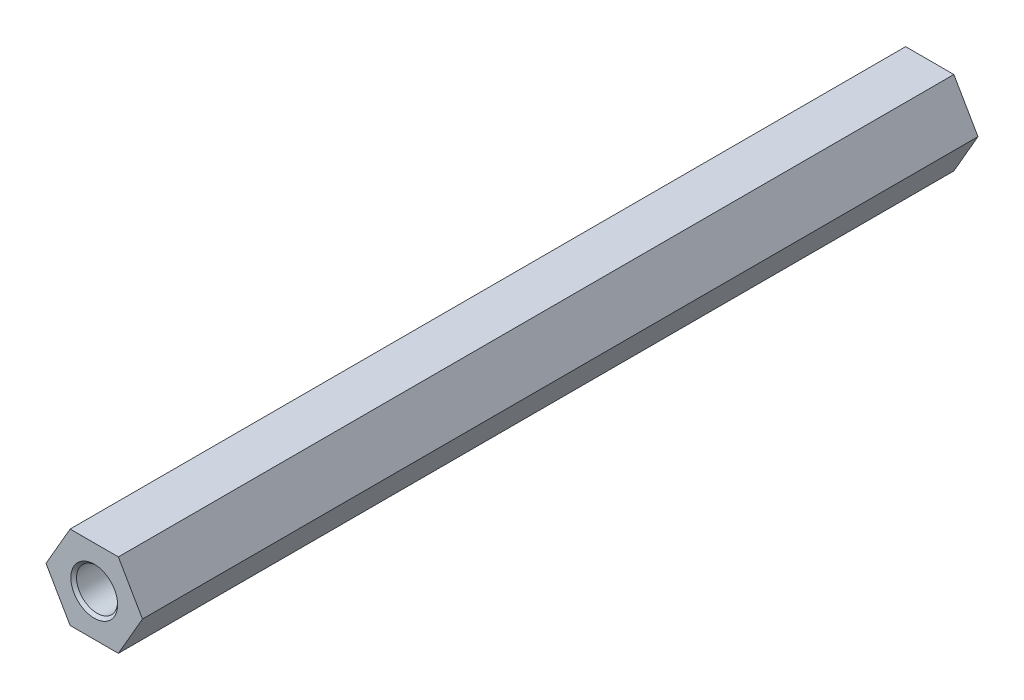
ISO-10303-21;
HEADER;
FILE_DESCRIPTION(('STEP AP214'),'2;1');
FILE_NAME('part.step','',(''),(''),'','','');
FILE_SCHEMA(('AUTOMOTIVE_DESIGN { 1 0 10303 214 1 1 1 1 }'));
ENDSEC;
DATA;
#1=APPLICATION_CONTEXT('core data for automotive mechanical design processes');
#2=APPLICATION_PROTOCOL_DEFINITION('international standard','automotive_design',2000,#1);
#3=PRODUCT_CONTEXT('',#1,'mechanical');
#4=PRODUCT('Part','Part','',(#3));
#5=PRODUCT_RELATED_PRODUCT_CATEGORY('part','',(#4));
#6=PRODUCT_DEFINITION_FORMATION('','',#4);
#7=PRODUCT_DEFINITION_CONTEXT('part definition',#1,'design');
#8=PRODUCT_DEFINITION('design','',#6,#7);
#9=PRODUCT_DEFINITION_SHAPE('','',#8);
#10=(LENGTH_UNIT() NAMED_UNIT(*) SI_UNIT(.MILLI.,.METRE.));
#11=(NAMED_UNIT(*) PLANE_ANGLE_UNIT() SI_UNIT($,.RADIAN.));
#12=(NAMED_UNIT(*) SI_UNIT($,.STERADIAN.) SOLID_ANGLE_UNIT());
#13=UNCERTAINTY_MEASURE_WITH_UNIT(LENGTH_MEASURE(1.E-05),#10,'distance_accuracy_value','');
#14=(GEOMETRIC_REPRESENTATION_CONTEXT(3) GLOBAL_UNCERTAINTY_ASSIGNED_CONTEXT((#13)) GLOBAL_UNIT_ASSIGNED_CONTEXT((#10,
#11,#12)) REPRESENTATION_CONTEXT('',''));
#15=CARTESIAN_POINT('',(0.,0.,0.));
#16=DIRECTION('',(0.,0.,1.));
#17=DIRECTION('',(1.,0.,0.));
#18=AXIS2_PLACEMENT_3D('',#15,#16,#17);
#19=CARTESIAN_POINT('',(-2.88675134594813,0.,-25.));
#20=DIRECTION('',(-0.866025403784439,-0.5,0.));
#21=DIRECTION('',(0.5,-0.866025403784439,0.));
#22=AXIS2_PLACEMENT_3D('',#19,#20,#21);
#23=PLANE('',#22);
#24=DIRECTION('',(0.,0.,1.));
#25=VECTOR('',#24,1.);
#26=CARTESIAN_POINT('',(-1.44337567297407,-2.5,-25.));
#27=LINE('',#26,#25);
#28=CARTESIAN_POINT('',(-1.44337567297407,-2.5,-24.999866055957));
#29=VERTEX_POINT('',#28);
#30=CARTESIAN_POINT('',(-1.44337567297407,-2.5,24.9997680021121));
#31=VERTEX_POINT('',#30);
#32=EDGE_CURVE('E141',#29,#31,#27,.T.);
#33=ORIENTED_EDGE('',*,*,#32,.T.);
#34=DIRECTION('',(-0.5,0.866025403784439,0.));
#35=VECTOR('',#34,1.);
#36=CARTESIAN_POINT('',(-2.88675134594813,0.,24.9997680021121));
#37=LINE('',#36,#35);
#38=CARTESIAN_POINT('',(-2.88675134594813,0.,24.9997680021121));
#39=VERTEX_POINT('',#38);
#40=EDGE_CURVE('E179',#31,#39,#37,.T.);
#41=ORIENTED_EDGE('',*,*,#40,.T.);
#42=DIRECTION('',(0.,0.,1.));
#43=VECTOR('',#42,1.);
#44=CARTESIAN_POINT('',(-2.88675134594813,0.,-25.));
#45=LINE('',#44,#43);
#46=CARTESIAN_POINT('',(-2.88675134594813,0.,-24.999866055957));
#47=VERTEX_POINT('',#46);
#48=EDGE_CURVE('E147',#47,#39,#45,.T.);
#49=ORIENTED_EDGE('',*,*,#48,.F.);
#50=DIRECTION('',(0.5,-0.866025403784439,0.));
#51=VECTOR('',#50,1.);
#52=CARTESIAN_POINT('',(-1.44337567297407,-2.5,-24.999866055957));
#53=LINE('',#52,#51);
#54=EDGE_CURVE('E177',#47,#29,#53,.T.);
#55=ORIENTED_EDGE('',*,*,#54,.T.);
#56=EDGE_LOOP('',(#33,#41,#49,#55));
#57=FACE_BOUND('',#56,.T.);
#58=ADVANCED_FACE('F34',(#57),#23,.T.);
#59=CARTESIAN_POINT('',(-1.44337567297406,2.5,-25.));
#60=DIRECTION('',(-0.866025403784439,0.5,0.));
#61=DIRECTION('',(-0.5,-0.866025403784439,0.));
#62=AXIS2_PLACEMENT_3D('',#59,#60,#61);
#63=PLANE('',#62);
#64=ORIENTED_EDGE('',*,*,#48,.T.);
#65=DIRECTION('',(0.5,0.866025403784439,0.));
#66=VECTOR('',#65,1.);
#67=CARTESIAN_POINT('',(-1.44337567297406,2.5,24.9997680021121));
#68=LINE('',#67,#66);
#69=CARTESIAN_POINT('',(-1.44337567297406,2.5,24.9997680021121));
#70=VERTEX_POINT('',#69);
#71=EDGE_CURVE('E184',#39,#70,#68,.T.);
#72=ORIENTED_EDGE('',*,*,#71,.T.);
#73=DIRECTION('',(0.,0.,1.));
#74=VECTOR('',#73,1.);
#75=CARTESIAN_POINT('',(-1.44337567297406,2.5,-25.));
#76=LINE('',#75,#74);
#77=CARTESIAN_POINT('',(-1.44337567297406,2.5,-24.999866055957));
#78=VERTEX_POINT('',#77);
#79=EDGE_CURVE('E151',#78,#70,#76,.T.);
#80=ORIENTED_EDGE('',*,*,#79,.F.);
#81=DIRECTION('',(-0.5,-0.866025403784439,0.));
#82=VECTOR('',#81,1.);
#83=CARTESIAN_POINT('',(-2.88675134594813,0.,-24.999866055957));
#84=LINE('',#83,#82);
#85=EDGE_CURVE('E182',#78,#47,#84,.T.);
#86=ORIENTED_EDGE('',*,*,#85,.T.);
#87=EDGE_LOOP('',(#64,#72,#80,#86));
#88=FACE_BOUND('',#87,.T.);
#89=ADVANCED_FACE('F260',(#88),#63,.T.);
#90=CARTESIAN_POINT('',(1.44337567297407,2.5,-25.));
#91=DIRECTION('',(0.,1.,0.));
#92=DIRECTION('',(0.,0.,1.));
#93=AXIS2_PLACEMENT_3D('',#90,#91,#92);
#94=PLANE('',#93);
#95=ORIENTED_EDGE('',*,*,#79,.T.);
#96=DIRECTION('',(1.,0.,0.));
#97=VECTOR('',#96,1.);
#98=CARTESIAN_POINT('',(1.44337567297407,2.5,24.9997680021121));
#99=LINE('',#98,#97);
#100=CARTESIAN_POINT('',(1.44337567297407,2.5,24.9997680021121));
#101=VERTEX_POINT('',#100);
#102=EDGE_CURVE('E188',#70,#101,#99,.T.);
#103=ORIENTED_EDGE('',*,*,#102,.T.);
#104=DIRECTION('',(0.,0.,1.));
#105=VECTOR('',#104,1.);
#106=CARTESIAN_POINT('',(1.44337567297407,2.5,-25.));
#107=LINE('',#106,#105);
#108=CARTESIAN_POINT('',(1.44337567297407,2.5,-24.999866055957));
#109=VERTEX_POINT('',#108);
#110=EDGE_CURVE('E154',#109,#101,#107,.T.);
#111=ORIENTED_EDGE('',*,*,#110,.F.);
#112=DIRECTION('',(-1.,0.,0.));
#113=VECTOR('',#112,1.);
#114=CARTESIAN_POINT('',(-1.44337567297406,2.5,-24.999866055957));
#115=LINE('',#114,#113);
#116=EDGE_CURVE('E186',#109,#78,#115,.T.);
#117=ORIENTED_EDGE('',*,*,#116,.T.);
#118=EDGE_LOOP('',(#95,#103,#111,#117));
#119=FACE_BOUND('',#118,.T.);
#120=ADVANCED_FACE('F266',(#119),#94,.T.);
#121=CARTESIAN_POINT('',(2.88675134594813,0.,-25.));
#122=DIRECTION('',(0.866025403784439,0.5,0.));
#123=DIRECTION('',(-0.5,0.866025403784439,0.));
#124=AXIS2_PLACEMENT_3D('',#121,#122,#123);
#125=PLANE('',#124);
#126=ORIENTED_EDGE('',*,*,#110,.T.);
#127=DIRECTION('',(0.5,-0.866025403784439,0.));
#128=VECTOR('',#127,1.);
#129=CARTESIAN_POINT('',(2.88675134594813,0.,24.9997680021121));
#130=LINE('',#129,#128);
#131=CARTESIAN_POINT('',(2.88675134594813,0.,24.9997680021121));
#132=VERTEX_POINT('',#131);
#133=EDGE_CURVE('E192',#101,#132,#130,.T.);
#134=ORIENTED_EDGE('',*,*,#133,.T.);
#135=DIRECTION('',(0.,0.,1.));
#136=VECTOR('',#135,1.);
#137=CARTESIAN_POINT('',(2.88675134594813,0.,-25.));
#138=LINE('',#137,#136);
#139=CARTESIAN_POINT('',(2.88675134594813,0.,-24.999866055957));
#140=VERTEX_POINT('',#139);
#141=EDGE_CURVE('E157',#140,#132,#138,.T.);
#142=ORIENTED_EDGE('',*,*,#141,.F.);
#143=DIRECTION('',(-0.5,0.866025403784439,0.));
#144=VECTOR('',#143,1.);
#145=CARTESIAN_POINT('',(1.44337567297407,2.5,-24.999866055957));
#146=LINE('',#145,#144);
#147=EDGE_CURVE('E190',#140,#109,#146,.T.);
#148=ORIENTED_EDGE('',*,*,#147,.T.);
#149=EDGE_LOOP('',(#126,#134,#142,#148));
#150=FACE_BOUND('',#149,.T.);
#151=ADVANCED_FACE('F365',(#150),#125,.T.);
#152=CARTESIAN_POINT('',(1.44337567297406,-2.5,-25.));
#153=DIRECTION('',(0.866025403784439,-0.5,0.));
#154=DIRECTION('',(0.5,0.866025403784439,0.));
#155=AXIS2_PLACEMENT_3D('',#152,#153,#154);
#156=PLANE('',#155);
#157=ORIENTED_EDGE('',*,*,#141,.T.);
#158=DIRECTION('',(-0.5,-0.866025403784439,0.));
#159=VECTOR('',#158,1.);
#160=CARTESIAN_POINT('',(1.44337567297406,-2.5,24.9997680021121));
#161=LINE('',#160,#159);
#162=CARTESIAN_POINT('',(1.44337567297406,-2.5,24.9997680021121));
#163=VERTEX_POINT('',#162);
#164=EDGE_CURVE('E196',#132,#163,#161,.T.);
#165=ORIENTED_EDGE('',*,*,#164,.T.);
#166=DIRECTION('',(0.,0.,1.));
#167=VECTOR('',#166,1.);
#168=CARTESIAN_POINT('',(1.44337567297406,-2.5,-25.));
#169=LINE('',#168,#167);
#170=CARTESIAN_POINT('',(1.44337567297406,-2.5,-24.999866055957));
#171=VERTEX_POINT('',#170);
#172=EDGE_CURVE('E160',#171,#163,#169,.T.);
#173=ORIENTED_EDGE('',*,*,#172,.F.);
#174=DIRECTION('',(0.5,0.866025403784439,0.));
#175=VECTOR('',#174,1.);
#176=CARTESIAN_POINT('',(2.88675134594813,0.,-24.999866055957));
#177=LINE('',#176,#175);
#178=EDGE_CURVE('E194',#171,#140,#177,.T.);
#179=ORIENTED_EDGE('',*,*,#178,.T.);
#180=EDGE_LOOP('',(#157,#165,#173,#179));
#181=FACE_BOUND('',#180,.T.);
#182=ADVANCED_FACE('F367',(#181),#156,.T.);
#183=CARTESIAN_POINT('',(-1.44337567297407,-2.5,-25.));
#184=DIRECTION('',(0.,-1.,0.));
#185=DIRECTION('',(1.,0.,0.));
#186=AXIS2_PLACEMENT_3D('',#183,#184,#185);
#187=PLANE('',#186);
#188=ORIENTED_EDGE('',*,*,#172,.T.);
#189=DIRECTION('',(-1.,0.,0.));
#190=VECTOR('',#189,1.);
#191=CARTESIAN_POINT('',(-1.44337567297407,-2.5,24.9997680021121));
#192=LINE('',#191,#190);
#193=EDGE_CURVE('E201',#163,#31,#192,.T.);
#194=ORIENTED_EDGE('',*,*,#193,.T.);
#195=ORIENTED_EDGE('',*,*,#32,.F.);
#196=DIRECTION('',(1.,0.,0.));
#197=VECTOR('',#196,1.);
#198=CARTESIAN_POINT('',(1.44337567297406,-2.5,-24.999866055957));
#199=LINE('',#198,#197);
#200=EDGE_CURVE('E198',#29,#171,#199,.T.);
#201=ORIENTED_EDGE('',*,*,#200,.T.);
#202=EDGE_LOOP('',(#188,#194,#195,#201));
#203=FACE_BOUND('',#202,.T.);
#204=ADVANCED_FACE('F271',(#203),#187,.T.);
#205=CARTESIAN_POINT('',(0.,0.,-25.));
#206=DIRECTION('',(0.,0.,1.));
#207=DIRECTION('',(1.,0.,0.));
#208=AXIS2_PLACEMENT_3D('',#205,#206,#207);
#209=PLANE('',#208);
#210=CARTESIAN_POINT('',(0.,0.,-25.));
#211=DIRECTION('',(0.,0.,1.));
#212=DIRECTION('',(1.,0.,0.));
#213=AXIS2_PLACEMENT_3D('',#210,#211,#212);
#214=CIRCLE('',#213,1.39999999999998);
#215=CARTESIAN_POINT('',(1.39999999999998,0.,-25.));
#216=VERTEX_POINT('',#215);
#217=EDGE_CURVE('E244',#216,#216,#214,.T.);
#218=ORIENTED_EDGE('',*,*,#217,.T.);
#219=EDGE_LOOP('',(#218));
#220=FACE_BOUND('',#219,.T.);
#221=DIRECTION('',(-0.5,-0.866025403784439,0.));
#222=VECTOR('',#221,1.);
#223=CARTESIAN_POINT('',(1.44317475690954,-2.49988400105607,-25.));
#224=LINE('',#223,#222);
#225=CARTESIAN_POINT('',(2.8864834578621,0.,-25.));
#226=VERTEX_POINT('',#225);
#227=CARTESIAN_POINT('',(1.44324172893105,-2.49976800211214,-25.));
#228=VERTEX_POINT('',#227);
#229=EDGE_CURVE('E49',#226,#228,#224,.T.);
#230=ORIENTED_EDGE('',*,*,#229,.T.);
#231=DIRECTION('',(-1.,0.,0.));
#232=VECTOR('',#231,1.);
#233=CARTESIAN_POINT('',(-1.44337567297407,-2.49976800211213,-25.));
#234=LINE('',#233,#232);
#235=CARTESIAN_POINT('',(-1.44324172893105,-2.49976800211213,-25.));
#236=VERTEX_POINT('',#235);
#237=EDGE_CURVE('E211',#228,#236,#234,.T.);
#238=ORIENTED_EDGE('',*,*,#237,.T.);
#239=DIRECTION('',(-0.5,0.866025403784439,0.));
#240=VECTOR('',#239,1.);
#241=CARTESIAN_POINT('',(-2.88655042988361,0.000115998943928501,-25.));
#242=LINE('',#241,#240);
#243=CARTESIAN_POINT('',(-2.8864834578621,0.,-25.));
#244=VERTEX_POINT('',#243);
#245=EDGE_CURVE('E203',#236,#244,#242,.T.);
#246=ORIENTED_EDGE('',*,*,#245,.T.);
#247=DIRECTION('',(0.5,0.866025403784439,0.));
#248=VECTOR('',#247,1.);
#249=CARTESIAN_POINT('',(-1.44317475690954,2.49988400105607,-25.));
#250=LINE('',#249,#248);
#251=CARTESIAN_POINT('',(-1.44324172893105,2.49976800211213,-25.));
#252=VERTEX_POINT('',#251);
#253=EDGE_CURVE('E205',#244,#252,#250,.T.);
#254=ORIENTED_EDGE('',*,*,#253,.T.);
#255=DIRECTION('',(1.,0.,0.));
#256=VECTOR('',#255,1.);
#257=CARTESIAN_POINT('',(1.44337567297407,2.49976800211213,-25.));
#258=LINE('',#257,#256);
#259=CARTESIAN_POINT('',(1.44324172893106,2.49976800211213,-25.));
#260=VERTEX_POINT('',#259);
#261=EDGE_CURVE('E207',#252,#260,#258,.T.);
#262=ORIENTED_EDGE('',*,*,#261,.T.);
#263=DIRECTION('',(0.5,-0.866025403784439,0.));
#264=VECTOR('',#263,1.);
#265=CARTESIAN_POINT('',(2.88655042988361,-0.000115998943928043,-25.));
#266=LINE('',#265,#264);
#267=EDGE_CURVE('E54',#260,#226,#266,.T.);
#268=ORIENTED_EDGE('',*,*,#267,.T.);
#269=EDGE_LOOP('',(#230,#238,#246,#254,#262,#268));
#270=FACE_BOUND('',#269,.T.);
#271=ADVANCED_FACE('F331',(#220,#270),#209,.F.);
#272=CARTESIAN_POINT('',(0.,0.,25.));
#273=DIRECTION('',(0.,0.,1.));
#274=DIRECTION('',(1.,0.,0.));
#275=AXIS2_PLACEMENT_3D('',#272,#273,#274);
#276=PLANE('',#275);
#277=CARTESIAN_POINT('',(0.,0.,25.));
#278=DIRECTION('',(0.,0.,1.));
#279=DIRECTION('',(1.,0.,0.));
#280=AXIS2_PLACEMENT_3D('',#277,#278,#279);
#281=CIRCLE('',#280,1.39999999999998);
#282=CARTESIAN_POINT('',(1.39999999999998,0.,25.));
#283=VERTEX_POINT('',#282);
#284=EDGE_CURVE('E11',#283,#283,#281,.F.);
#285=ORIENTED_EDGE('',*,*,#284,.T.);
#286=EDGE_LOOP('',(#285));
#287=FACE_BOUND('',#286,.T.);
#288=DIRECTION('',(-0.5,-0.866025403784439,0.));
#289=VECTOR('',#288,1.);
#290=CARTESIAN_POINT('',(-2.16494751051716,1.24993302797849,25.));
#291=LINE('',#290,#289);
#292=CARTESIAN_POINT('',(-1.44329834034477,2.49986605595699,25.));
#293=VERTEX_POINT('',#292);
#294=CARTESIAN_POINT('',(-2.88659668068955,0.,25.));
#295=VERTEX_POINT('',#294);
#296=EDGE_CURVE('E172',#293,#295,#291,.T.);
#297=ORIENTED_EDGE('',*,*,#296,.T.);
#298=DIRECTION('',(0.5,-0.866025403784439,0.));
#299=VECTOR('',#298,1.);
#300=CARTESIAN_POINT('',(-2.16494751051716,-1.24993302797849,25.));
#301=LINE('',#300,#299);
#302=CARTESIAN_POINT('',(-1.44329834034478,-2.49986605595699,25.));
#303=VERTEX_POINT('',#302);
#304=EDGE_CURVE('E174',#295,#303,#301,.T.);
#305=ORIENTED_EDGE('',*,*,#304,.T.);
#306=DIRECTION('',(1.,0.,0.));
#307=VECTOR('',#306,1.);
#308=CARTESIAN_POINT('',(0.,-2.49986605595699,25.));
#309=LINE('',#308,#307);
#310=CARTESIAN_POINT('',(1.44329834034477,-2.49986605595699,25.));
#311=VERTEX_POINT('',#310);
#312=EDGE_CURVE('E150',#303,#311,#309,.T.);
#313=ORIENTED_EDGE('',*,*,#312,.T.);
#314=DIRECTION('',(0.5,0.866025403784439,0.));
#315=VECTOR('',#314,1.);
#316=CARTESIAN_POINT('',(2.16494751051716,-1.24993302797849,25.));
#317=LINE('',#316,#315);
#318=CARTESIAN_POINT('',(2.88659668068955,0.,25.));
#319=VERTEX_POINT('',#318);
#320=EDGE_CURVE('E166',#311,#319,#317,.T.);
#321=ORIENTED_EDGE('',*,*,#320,.T.);
#322=DIRECTION('',(-0.5,0.866025403784439,0.));
#323=VECTOR('',#322,1.);
#324=CARTESIAN_POINT('',(2.16494751051716,1.24993302797849,25.));
#325=LINE('',#324,#323);
#326=CARTESIAN_POINT('',(1.44329834034478,2.49986605595699,25.));
#327=VERTEX_POINT('',#326);
#328=EDGE_CURVE('E168',#319,#327,#325,.T.);
#329=ORIENTED_EDGE('',*,*,#328,.T.);
#330=DIRECTION('',(-1.,0.,0.));
#331=VECTOR('',#330,1.);
#332=CARTESIAN_POINT('',(0.,2.49986605595699,25.));
#333=LINE('',#332,#331);
#334=EDGE_CURVE('E170',#327,#293,#333,.T.);
#335=ORIENTED_EDGE('',*,*,#334,.T.);
#336=EDGE_LOOP('',(#297,#305,#313,#321,#329,#335));
#337=FACE_BOUND('',#336,.T.);
#338=ADVANCED_FACE('F357',(#287,#337),#276,.T.);
#339=CARTESIAN_POINT('',(0.,0.,-14.));
#340=DIRECTION('',(0.,0.,-1.));
#341=DIRECTION('',(-1.,0.,0.));
#342=AXIS2_PLACEMENT_3D('',#339,#340,#341);
#343=CONICAL_SURFACE('',#342,1.22949999999999,1.02974425867664);
#344=CARTESIAN_POINT('',(0.,0.,-13.2612418689056));
#345=VERTEX_POINT('',#344);
#346=VERTEX_LOOP('',#345);
#347=FACE_BOUND('',#346,.T.);
#348=CARTESIAN_POINT('',(0.,0.,-14.));
#349=DIRECTION('',(0.,0.,-1.));
#350=DIRECTION('',(-1.,0.,0.));
#351=AXIS2_PLACEMENT_3D('',#348,#349,#350);
#352=CIRCLE('',#351,1.22949999999999);
#353=CARTESIAN_POINT('',(-1.22949999999999,0.,-14.));
#354=VERTEX_POINT('',#353);
#355=EDGE_CURVE('E137',#354,#354,#352,.T.);
#356=ORIENTED_EDGE('',*,*,#355,.T.);
#357=EDGE_LOOP('',(#356));
#358=FACE_BOUND('',#357,.T.);
#359=ADVANCED_FACE('F379',(#347,#358),#343,.F.);
#360=CARTESIAN_POINT('',(0.,0.,-25.));
#361=DIRECTION('',(0.,0.,-1.));
#362=DIRECTION('',(-1.,0.,0.));
#363=AXIS2_PLACEMENT_3D('',#360,#361,#362);
#364=CYLINDRICAL_SURFACE('',#363,1.22949999999999);
#365=CARTESIAN_POINT('',(0.,0.,-24.8295));
#366=DIRECTION('',(0.,0.,1.));
#367=DIRECTION('',(1.,0.,0.));
#368=AXIS2_PLACEMENT_3D('',#365,#366,#367);
#369=CIRCLE('',#368,1.22949999999999);
#370=CARTESIAN_POINT('',(1.22949999999999,0.,-24.8295));
#371=VERTEX_POINT('',#370);
#372=EDGE_CURVE('E213',#371,#371,#369,.F.);
#373=ORIENTED_EDGE('',*,*,#372,.T.);
#374=EDGE_LOOP('',(#373));
#375=FACE_BOUND('',#374,.T.);
#376=ORIENTED_EDGE('',*,*,#355,.F.);
#377=EDGE_LOOP('',(#376));
#378=FACE_BOUND('',#377,.T.);
#379=ADVANCED_FACE('F131',(#375,#378),#364,.F.);
#380=CARTESIAN_POINT('',(0.,0.,14.));
#381=DIRECTION('',(0.,0.,1.));
#382=DIRECTION('',(1.,0.,0.));
#383=AXIS2_PLACEMENT_3D('',#380,#381,#382);
#384=CONICAL_SURFACE('',#383,1.22949999999999,1.02974425867664);
#385=CARTESIAN_POINT('',(0.,0.,13.2612418689056));
#386=VERTEX_POINT('',#385);
#387=VERTEX_LOOP('',#386);
#388=FACE_BOUND('',#387,.T.);
#389=CARTESIAN_POINT('',(0.,0.,14.));
#390=DIRECTION('',(0.,0.,1.));
#391=DIRECTION('',(1.,0.,0.));
#392=AXIS2_PLACEMENT_3D('',#389,#390,#391);
#393=CIRCLE('',#392,1.22949999999999);
#394=CARTESIAN_POINT('',(1.22949999999999,0.,14.));
#395=VERTEX_POINT('',#394);
#396=EDGE_CURVE('E135',#395,#395,#393,.T.);
#397=ORIENTED_EDGE('',*,*,#396,.T.);
#398=EDGE_LOOP('',(#397));
#399=FACE_BOUND('',#398,.T.);
#400=ADVANCED_FACE('F127',(#388,#399),#384,.F.);
#401=CARTESIAN_POINT('',(0.,0.,25.));
#402=DIRECTION('',(0.,0.,1.));
#403=DIRECTION('',(1.,0.,0.));
#404=AXIS2_PLACEMENT_3D('',#401,#402,#403);
#405=CYLINDRICAL_SURFACE('',#404,1.22949999999999);
#406=CARTESIAN_POINT('',(0.,0.,24.8295));
#407=DIRECTION('',(0.,0.,1.));
#408=DIRECTION('',(1.,0.,0.));
#409=AXIS2_PLACEMENT_3D('',#406,#407,#408);
#410=CIRCLE('',#409,1.22949999999999);
#411=CARTESIAN_POINT('',(1.22949999999999,0.,24.8295));
#412=VERTEX_POINT('',#411);
#413=EDGE_CURVE('E42',#412,#412,#410,.T.);
#414=ORIENTED_EDGE('',*,*,#413,.T.);
#415=EDGE_LOOP('',(#414));
#416=FACE_BOUND('',#415,.T.);
#417=ORIENTED_EDGE('',*,*,#396,.F.);
#418=EDGE_LOOP('',(#417));
#419=FACE_BOUND('',#418,.T.);
#420=ADVANCED_FACE('F130',(#416,#419),#405,.F.);
#421=CARTESIAN_POINT('',(2.16494751051716,1.24993302797849,25.));
#422=DIRECTION('',(-0.750000000002462,-0.43301270189364,-0.499999999995076));
#423=DIRECTION('',(-0.5,0.866025403784439,0.));
#424=AXIS2_PLACEMENT_3D('',#421,#422,#423);
#425=PLANE('',#424);
#426=DIRECTION('',(-0.554700196220809,1.5554457480673E-12,0.832050294340791));
#427=VECTOR('',#426,1.);
#428=CARTESIAN_POINT('',(2.66455078217958,6.27753057869107E-13,25.3330688477688));
#429=LINE('',#428,#427);
#430=EDGE_CURVE('E144',#132,#319,#429,.T.);
#431=ORIENTED_EDGE('',*,*,#430,.F.);
#432=ORIENTED_EDGE('',*,*,#133,.F.);
#433=DIRECTION('',(-0.277350098109575,-0.480384461411553,0.832050294340998));
#434=VECTOR('',#433,1.);
#435=CARTESIAN_POINT('',(1.33227539108938,2.30756866703988,25.3330688477711));
#436=LINE('',#435,#434);
#437=EDGE_CURVE('E138',#327,#101,#436,.F.);
#438=ORIENTED_EDGE('',*,*,#437,.F.);
#439=ORIENTED_EDGE('',*,*,#328,.F.);
#440=EDGE_LOOP('',(#431,#432,#438,#439));
#441=FACE_BOUND('',#440,.T.);
#442=ADVANCED_FACE('F293',(#441),#425,.F.);
#443=CARTESIAN_POINT('',(0.,2.49986605595699,25.));
#444=DIRECTION('',(0.,-0.866025403786931,-0.499999999995683));
#445=DIRECTION('',(-1.,0.,0.));
#446=AXIS2_PLACEMENT_3D('',#443,#444,#445);
#447=PLANE('',#446);
#448=ORIENTED_EDGE('',*,*,#437,.T.);
#449=ORIENTED_EDGE('',*,*,#102,.F.);
#450=DIRECTION('',(0.277350098110819,-0.480384461411373,0.832050294340687));
#451=VECTOR('',#450,1.);
#452=CARTESIAN_POINT('',(-1.33227539108892,2.30756866704002,25.3330688477709));
#453=LINE('',#452,#451);
#454=EDGE_CURVE('E222',#293,#70,#453,.F.);
#455=ORIENTED_EDGE('',*,*,#454,.F.);
#456=ORIENTED_EDGE('',*,*,#334,.F.);
#457=EDGE_LOOP('',(#448,#449,#455,#456));
#458=FACE_BOUND('',#457,.T.);
#459=ADVANCED_FACE('F289',(#458),#447,.F.);
#460=CARTESIAN_POINT('',(2.16494751051716,-1.24993302797849,25.));
#461=DIRECTION('',(-0.750000000001855,0.43301270189329,-0.49999999999629));
#462=DIRECTION('',(0.5,0.866025403784439,0.));
#463=AXIS2_PLACEMENT_3D('',#460,#461,#462);
#464=PLANE('',#463);
#465=ORIENTED_EDGE('',*,*,#430,.T.);
#466=ORIENTED_EDGE('',*,*,#320,.F.);
#467=DIRECTION('',(-0.277350098111233,0.480384461411314,0.832050294340583));
#468=VECTOR('',#467,1.);
#469=CARTESIAN_POINT('',(1.33227539108858,-2.30756866703976,25.3330688477713));
#470=LINE('',#469,#468);
#471=EDGE_CURVE('E219',#163,#311,#470,.T.);
#472=ORIENTED_EDGE('',*,*,#471,.F.);
#473=ORIENTED_EDGE('',*,*,#164,.F.);
#474=EDGE_LOOP('',(#465,#466,#472,#473));
#475=FACE_BOUND('',#474,.T.);
#476=ADVANCED_FACE('F285',(#475),#464,.F.);
#477=CARTESIAN_POINT('',(-2.16494751051716,1.24993302797849,25.));
#478=DIRECTION('',(0.750000000002007,-0.433012701893378,-0.499999999995987));
#479=DIRECTION('',(-0.5,-0.866025403784439,0.));
#480=AXIS2_PLACEMENT_3D('',#477,#478,#479);
#481=PLANE('',#480);
#482=ORIENTED_EDGE('',*,*,#454,.T.);
#483=ORIENTED_EDGE('',*,*,#71,.F.);
#484=DIRECTION('',(0.55470019622143,7.77764298557443E-13,0.832050294340376));
#485=VECTOR('',#484,1.);
#486=CARTESIAN_POINT('',(-2.66455078217747,3.07046055247895E-13,25.3330688477714));
#487=LINE('',#486,#485);
#488=EDGE_CURVE('E216',#295,#39,#487,.F.);
#489=ORIENTED_EDGE('',*,*,#488,.F.);
#490=ORIENTED_EDGE('',*,*,#296,.F.);
#491=EDGE_LOOP('',(#482,#483,#489,#490));
#492=FACE_BOUND('',#491,.T.);
#493=ADVANCED_FACE('F281',(#492),#481,.F.);
#494=CARTESIAN_POINT('',(0.,-2.49986605595699,25.));
#495=DIRECTION('',(0.,0.866025403786931,-0.499999999995683));
#496=DIRECTION('',(1.,0.,0.));
#497=AXIS2_PLACEMENT_3D('',#494,#495,#496);
#498=PLANE('',#497);
#499=ORIENTED_EDGE('',*,*,#471,.T.);
#500=ORIENTED_EDGE('',*,*,#312,.F.);
#501=DIRECTION('',(-0.277350098111648,-0.480384461411254,-0.83205029434048));
#502=VECTOR('',#501,1.);
#503=CARTESIAN_POINT('',(-1.33227539108826,-2.30756866703949,25.3330688477718));
#504=LINE('',#503,#502);
#505=EDGE_CURVE('E214',#31,#303,#504,.F.);
#506=ORIENTED_EDGE('',*,*,#505,.F.);
#507=ORIENTED_EDGE('',*,*,#193,.F.);
#508=EDGE_LOOP('',(#499,#500,#506,#507));
#509=FACE_BOUND('',#508,.T.);
#510=ADVANCED_FACE('F277',(#509),#498,.F.);
#511=CARTESIAN_POINT('',(-2.16494751051716,-1.24993302797849,25.));
#512=DIRECTION('',(0.750000000001703,0.433012701893202,-0.499999999996594));
#513=DIRECTION('',(0.5,-0.866025403784439,0.));
#514=AXIS2_PLACEMENT_3D('',#511,#512,#513);
#515=PLANE('',#514);
#516=ORIENTED_EDGE('',*,*,#488,.T.);
#517=ORIENTED_EDGE('',*,*,#40,.F.);
#518=ORIENTED_EDGE('',*,*,#505,.T.);
#519=ORIENTED_EDGE('',*,*,#304,.F.);
#520=EDGE_LOOP('',(#516,#517,#518,#519));
#521=FACE_BOUND('',#520,.T.);
#522=ADVANCED_FACE('F273',(#521),#515,.F.);
#523=CARTESIAN_POINT('',(1.44337567297407,2.5,-24.999866055957));
#524=DIRECTION('',(0.,0.500000000006198,-0.86602540378086));
#525=DIRECTION('',(1.,0.,0.));
#526=AXIS2_PLACEMENT_3D('',#523,#524,#525);
#527=PLANE('',#526);
#528=DIRECTION('',(-0.447213595497142,-0.774596669239502,-0.447213595506206));
#529=VECTOR('',#528,1.);
#530=CARTESIAN_POINT('',(1.44337567297407,2.5,-24.999866055957));
#531=LINE('',#530,#529);
#532=EDGE_CURVE('E237',#260,#109,#531,.F.);
#533=ORIENTED_EDGE('',*,*,#532,.F.);
#534=ORIENTED_EDGE('',*,*,#261,.F.);
#535=DIRECTION('',(0.447213595496808,-0.774596669239647,-0.447213595506289));
#536=VECTOR('',#535,1.);
#537=CARTESIAN_POINT('',(-1.44337567297406,2.5,-24.999866055957));
#538=LINE('',#537,#536);
#539=EDGE_CURVE('E217',#78,#252,#538,.T.);
#540=ORIENTED_EDGE('',*,*,#539,.F.);
#541=ORIENTED_EDGE('',*,*,#116,.F.);
#542=EDGE_LOOP('',(#533,#534,#540,#541));
#543=FACE_BOUND('',#542,.T.);
#544=ADVANCED_FACE('F276',(#543),#527,.T.);
#545=CARTESIAN_POINT('',(-1.44337567297406,2.5,-24.999866055957));
#546=DIRECTION('',(-0.433012701898346,0.250000000003537,-0.866025403780354));
#547=DIRECTION('',(0.5,0.866025403784439,0.));
#548=AXIS2_PLACEMENT_3D('',#545,#546,#547);
#549=PLANE('',#548);
#550=ORIENTED_EDGE('',*,*,#539,.T.);
#551=ORIENTED_EDGE('',*,*,#253,.F.);
#552=DIRECTION('',(0.894427190996625,7.23855338376652E-13,-0.44721359550654));
#553=VECTOR('',#552,1.);
#554=CARTESIAN_POINT('',(-2.88675134594813,0.,-24.999866055957));
#555=LINE('',#554,#553);
#556=EDGE_CURVE('E234',#47,#244,#555,.T.);
#557=ORIENTED_EDGE('',*,*,#556,.F.);
#558=ORIENTED_EDGE('',*,*,#85,.F.);
#559=EDGE_LOOP('',(#550,#551,#557,#558));
#560=FACE_BOUND('',#559,.T.);
#561=ADVANCED_FACE('F312',(#560),#549,.T.);
#562=CARTESIAN_POINT('',(2.88675134594813,0.,-24.999866055957));
#563=DIRECTION('',(0.433012701898194,0.25000000000345,-0.866025403780455));
#564=DIRECTION('',(0.5,-0.866025403784439,0.));
#565=AXIS2_PLACEMENT_3D('',#562,#563,#564);
#566=PLANE('',#565);
#567=ORIENTED_EDGE('',*,*,#532,.T.);
#568=ORIENTED_EDGE('',*,*,#147,.F.);
#569=DIRECTION('',(-0.894427190996625,0.,-0.44721359550654));
#570=VECTOR('',#569,1.);
#571=CARTESIAN_POINT('',(2.88675134594813,0.,-24.999866055957));
#572=LINE('',#571,#570);
#573=EDGE_CURVE('E231',#226,#140,#572,.F.);
#574=ORIENTED_EDGE('',*,*,#573,.F.);
#575=ORIENTED_EDGE('',*,*,#267,.F.);
#576=EDGE_LOOP('',(#567,#568,#574,#575));
#577=FACE_BOUND('',#576,.T.);
#578=ADVANCED_FACE('F308',(#577),#566,.T.);
#579=CARTESIAN_POINT('',(-2.88675134594813,0.,-24.999866055957));
#580=DIRECTION('',(-0.433012701898043,-0.250000000003362,-0.866025403780556));
#581=DIRECTION('',(-0.5,0.866025403784439,0.));
#582=AXIS2_PLACEMENT_3D('',#579,#580,#581);
#583=PLANE('',#582);
#584=ORIENTED_EDGE('',*,*,#556,.T.);
#585=ORIENTED_EDGE('',*,*,#245,.F.);
#586=DIRECTION('',(-0.447213595497477,-0.774596669239357,0.447213595506122));
#587=VECTOR('',#586,1.);
#588=CARTESIAN_POINT('',(-0.86602540378842,-1.50000000000409,-25.5772163251538));
#589=LINE('',#588,#587);
#590=EDGE_CURVE('E229',#29,#236,#589,.F.);
#591=ORIENTED_EDGE('',*,*,#590,.F.);
#592=ORIENTED_EDGE('',*,*,#54,.F.);
#593=EDGE_LOOP('',(#584,#585,#591,#592));
#594=FACE_BOUND('',#593,.T.);
#595=ADVANCED_FACE('F304',(#594),#583,.T.);
#596=CARTESIAN_POINT('',(1.44337567297406,-2.5,-24.999866055957));
#597=DIRECTION('',(0.433012701898194,-0.25000000000345,-0.866025403780455));
#598=DIRECTION('',(-0.5,-0.866025403784439,0.));
#599=AXIS2_PLACEMENT_3D('',#596,#597,#598);
#600=PLANE('',#599);
#601=ORIENTED_EDGE('',*,*,#573,.T.);
#602=ORIENTED_EDGE('',*,*,#178,.F.);
#603=DIRECTION('',(-0.447213595497142,0.774596669239502,-0.447213595506206));
#604=VECTOR('',#603,1.);
#605=CARTESIAN_POINT('',(1.44337567297406,-2.5,-24.999866055957));
#606=LINE('',#605,#604);
#607=EDGE_CURVE('E227',#228,#171,#606,.F.);
#608=ORIENTED_EDGE('',*,*,#607,.F.);
#609=ORIENTED_EDGE('',*,*,#229,.F.);
#610=EDGE_LOOP('',(#601,#602,#608,#609));
#611=FACE_BOUND('',#610,.T.);
#612=ADVANCED_FACE('F300',(#611),#600,.T.);
#613=CARTESIAN_POINT('',(-1.44337567297407,-2.5,-24.999866055957));
#614=DIRECTION('',(0.,-0.500000000006198,-0.86602540378086));
#615=DIRECTION('',(-1.,0.,0.));
#616=AXIS2_PLACEMENT_3D('',#613,#614,#615);
#617=PLANE('',#616);
#618=ORIENTED_EDGE('',*,*,#590,.T.);
#619=ORIENTED_EDGE('',*,*,#237,.F.);
#620=ORIENTED_EDGE('',*,*,#607,.T.);
#621=ORIENTED_EDGE('',*,*,#200,.F.);
#622=EDGE_LOOP('',(#618,#619,#620,#621));
#623=FACE_BOUND('',#622,.T.);
#624=ADVANCED_FACE('F256',(#623),#617,.T.);
#625=CARTESIAN_POINT('',(0.,0.,-24.8295));
#626=DIRECTION('',(0.,0.,-1.));
#627=DIRECTION('',(-1.,0.,0.));
#628=AXIS2_PLACEMENT_3D('',#625,#626,#627);
#629=CONICAL_SURFACE('',#628,1.22949999999999,0.785398163397456);
#630=ORIENTED_EDGE('',*,*,#217,.F.);
#631=EDGE_LOOP('',(#630));
#632=FACE_BOUND('',#631,.T.);
#633=ORIENTED_EDGE('',*,*,#372,.F.);
#634=EDGE_LOOP('',(#633));
#635=FACE_BOUND('',#634,.T.);
#636=ADVANCED_FACE('F251',(#632,#635),#629,.F.);
#637=CARTESIAN_POINT('',(0.,0.,24.8295));
#638=DIRECTION('',(0.,0.,1.));
#639=DIRECTION('',(1.,0.,0.));
#640=AXIS2_PLACEMENT_3D('',#637,#638,#639);
#641=CONICAL_SURFACE('',#640,1.22949999999999,0.785398163397456);
#642=ORIENTED_EDGE('',*,*,#284,.F.);
#643=EDGE_LOOP('',(#642));
#644=FACE_BOUND('',#643,.T.);
#645=ORIENTED_EDGE('',*,*,#413,.F.);
#646=EDGE_LOOP('',(#645));
#647=FACE_BOUND('',#646,.T.);
#648=ADVANCED_FACE('F36',(#644,#647),#641,.F.);
#649=CLOSED_SHELL('',(#58,#89,#120,#151,#182,#204,#271,#338,#359,#379,#400,#420,#442,#459,#476,
#493,#510,#522,#544,#561,#578,#595,#612,#624,#636,#648));
#650=MANIFOLD_SOLID_BREP('B2',#649);
#651=ADVANCED_BREP_SHAPE_REPRESENTATION('',(#18,#650),#14);
#652=SHAPE_DEFINITION_REPRESENTATION(#9,#651);
ENDSEC;
END-ISO-10303-21;
